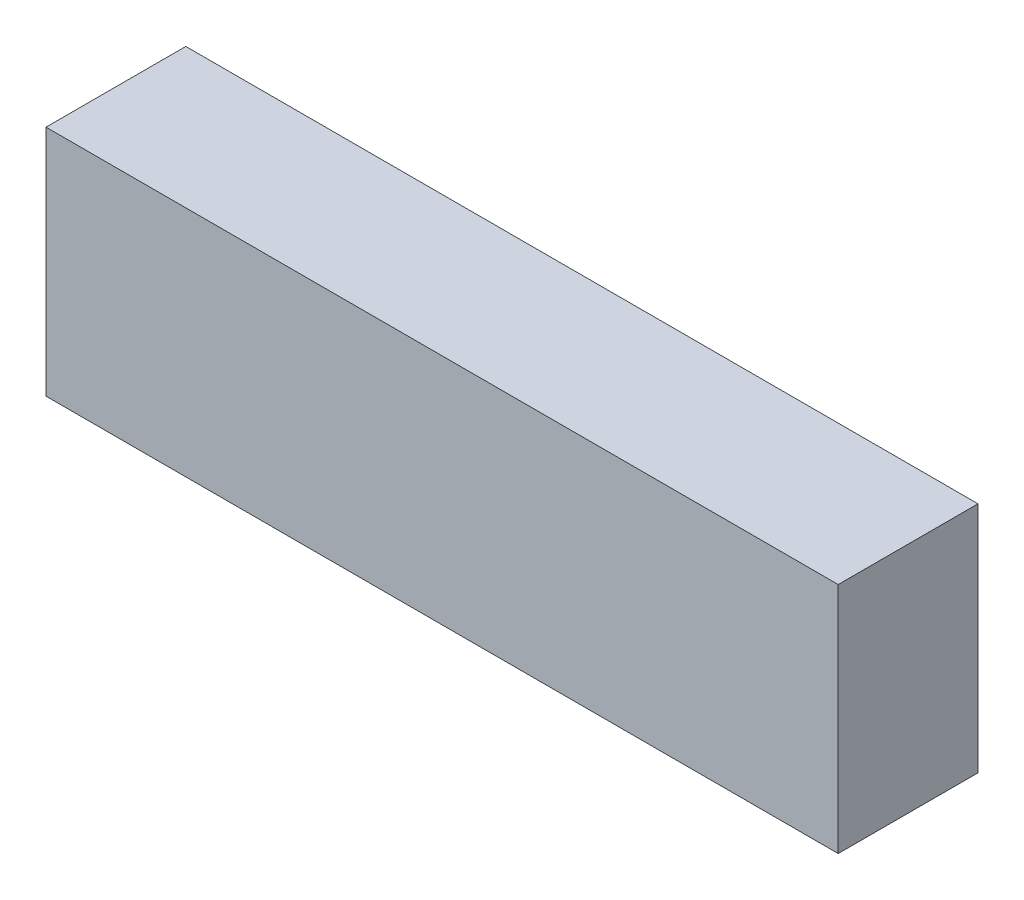
ISO-10303-21;
HEADER;
FILE_DESCRIPTION(('STEP AP214'),'2;1');
FILE_NAME('part.step','',(''),(''),'','','');
FILE_SCHEMA(('AUTOMOTIVE_DESIGN { 1 0 10303 214 1 1 1 1 }'));
ENDSEC;
DATA;
#1=APPLICATION_CONTEXT('core data for automotive mechanical design processes');
#2=APPLICATION_PROTOCOL_DEFINITION('international standard','automotive_design',2000,#1);
#3=PRODUCT_CONTEXT('',#1,'mechanical');
#4=PRODUCT('Part','Part','',(#3));
#5=PRODUCT_RELATED_PRODUCT_CATEGORY('part','',(#4));
#6=PRODUCT_DEFINITION_FORMATION('','',#4);
#7=PRODUCT_DEFINITION_CONTEXT('part definition',#1,'design');
#8=PRODUCT_DEFINITION('design','',#6,#7);
#9=PRODUCT_DEFINITION_SHAPE('','',#8);
#10=(LENGTH_UNIT() NAMED_UNIT(*) SI_UNIT(.MILLI.,.METRE.));
#11=(NAMED_UNIT(*) PLANE_ANGLE_UNIT() SI_UNIT($,.RADIAN.));
#12=(NAMED_UNIT(*) SI_UNIT($,.STERADIAN.) SOLID_ANGLE_UNIT());
#13=UNCERTAINTY_MEASURE_WITH_UNIT(LENGTH_MEASURE(1.E-05),#10,'distance_accuracy_value','');
#14=(GEOMETRIC_REPRESENTATION_CONTEXT(3) GLOBAL_UNCERTAINTY_ASSIGNED_CONTEXT((#13)) GLOBAL_UNIT_ASSIGNED_CONTEXT((#10,
#11,#12)) REPRESENTATION_CONTEXT('',''));
#15=CARTESIAN_POINT('',(0.,0.,0.));
#16=DIRECTION('',(0.,0.,1.));
#17=DIRECTION('',(1.,0.,0.));
#18=AXIS2_PLACEMENT_3D('',#15,#16,#17);
#19=CARTESIAN_POINT('',(491.834843653032,1149.02699768533,153.1716134156));
#20=DIRECTION('',(1.,0.,0.));
#21=DIRECTION('',(0.,0.,-1.));
#22=AXIS2_PLACEMENT_3D('',#19,#20,#21);
#23=PLANE('',#22);
#24=DIRECTION('',(0.,-1.,0.));
#25=VECTOR('',#24,1.);
#26=CARTESIAN_POINT('',(491.834843653032,1149.02699768533,3.17161341559968));
#27=LINE('',#26,#25);
#28=CARTESIAN_POINT('',(491.834843653032,1149.02699768533,3.17161341559968));
#29=VERTEX_POINT('',#28);
#30=CARTESIAN_POINT('',(491.834843653032,899.026997685325,3.17161341559968));
#31=VERTEX_POINT('',#30);
#32=EDGE_CURVE('E96',#29,#31,#27,.T.);
#33=ORIENTED_EDGE('',*,*,#32,.T.);
#34=DIRECTION('',(0.,0.,-1.));
#35=VECTOR('',#34,1.);
#36=CARTESIAN_POINT('',(491.834843653032,899.026997685325,153.1716134156));
#37=LINE('',#36,#35);
#38=CARTESIAN_POINT('',(491.834843653032,899.026997685325,153.1716134156));
#39=VERTEX_POINT('',#38);
#40=EDGE_CURVE('E11',#39,#31,#37,.T.);
#41=ORIENTED_EDGE('',*,*,#40,.F.);
#42=DIRECTION('',(0.,-1.,0.));
#43=VECTOR('',#42,1.);
#44=CARTESIAN_POINT('',(491.834843653032,1149.02699768533,153.1716134156));
#45=LINE('',#44,#43);
#46=CARTESIAN_POINT('',(491.834843653032,1149.02699768533,153.1716134156));
#47=VERTEX_POINT('',#46);
#48=EDGE_CURVE('E84',#47,#39,#45,.T.);
#49=ORIENTED_EDGE('',*,*,#48,.F.);
#50=DIRECTION('',(0.,0.,-1.));
#51=VECTOR('',#50,1.);
#52=CARTESIAN_POINT('',(491.834843653032,1149.02699768533,153.1716134156));
#53=LINE('',#52,#51);
#54=EDGE_CURVE('E92',#47,#29,#53,.T.);
#55=ORIENTED_EDGE('',*,*,#54,.T.);
#56=EDGE_LOOP('',(#33,#41,#49,#55));
#57=FACE_BOUND('',#56,.T.);
#58=ADVANCED_FACE('F33',(#57),#23,.F.);
#59=CARTESIAN_POINT('',(491.834843653032,899.026997685325,153.1716134156));
#60=DIRECTION('',(0.,1.,0.));
#61=DIRECTION('',(0.,0.,1.));
#62=AXIS2_PLACEMENT_3D('',#59,#60,#61);
#63=PLANE('',#62);
#64=DIRECTION('',(1.,0.,0.));
#65=VECTOR('',#64,1.);
#66=CARTESIAN_POINT('',(491.834843653032,899.026997685325,3.17161341559968));
#67=LINE('',#66,#65);
#68=CARTESIAN_POINT('',(1341.83484365303,899.026997685325,3.17161341559968));
#69=VERTEX_POINT('',#68);
#70=EDGE_CURVE('E88',#31,#69,#67,.T.);
#71=ORIENTED_EDGE('',*,*,#70,.T.);
#72=DIRECTION('',(0.,0.,-1.));
#73=VECTOR('',#72,1.);
#74=CARTESIAN_POINT('',(1341.83484365303,899.026997685325,153.1716134156));
#75=LINE('',#74,#73);
#76=CARTESIAN_POINT('',(1341.83484365303,899.026997685325,153.1716134156));
#77=VERTEX_POINT('',#76);
#78=EDGE_CURVE('E41',#77,#69,#75,.T.);
#79=ORIENTED_EDGE('',*,*,#78,.F.);
#80=DIRECTION('',(1.,0.,0.));
#81=VECTOR('',#80,1.);
#82=CARTESIAN_POINT('',(491.834843653032,899.026997685325,153.1716134156));
#83=LINE('',#82,#81);
#84=EDGE_CURVE('E79',#39,#77,#83,.T.);
#85=ORIENTED_EDGE('',*,*,#84,.F.);
#86=ORIENTED_EDGE('',*,*,#40,.T.);
#87=EDGE_LOOP('',(#71,#79,#85,#86));
#88=FACE_BOUND('',#87,.T.);
#89=ADVANCED_FACE('F87',(#88),#63,.F.);
#90=CARTESIAN_POINT('',(1341.83484365303,1149.02699768533,153.1716134156));
#91=DIRECTION('',(-1.,0.,0.));
#92=DIRECTION('',(0.,0.,1.));
#93=AXIS2_PLACEMENT_3D('',#90,#91,#92);
#94=PLANE('',#93);
#95=DIRECTION('',(0.,1.,0.));
#96=VECTOR('',#95,1.);
#97=CARTESIAN_POINT('',(1341.83484365303,1149.02699768533,3.17161341559968));
#98=LINE('',#97,#96);
#99=CARTESIAN_POINT('',(1341.83484365303,1149.02699768533,3.17161341559968));
#100=VERTEX_POINT('',#99);
#101=EDGE_CURVE('E66',#69,#100,#98,.T.);
#102=ORIENTED_EDGE('',*,*,#101,.T.);
#103=DIRECTION('',(0.,0.,-1.));
#104=VECTOR('',#103,1.);
#105=CARTESIAN_POINT('',(1341.83484365303,1149.02699768533,153.1716134156));
#106=LINE('',#105,#104);
#107=CARTESIAN_POINT('',(1341.83484365303,1149.02699768533,153.1716134156));
#108=VERTEX_POINT('',#107);
#109=EDGE_CURVE('E89',#108,#100,#106,.T.);
#110=ORIENTED_EDGE('',*,*,#109,.F.);
#111=DIRECTION('',(0.,1.,0.));
#112=VECTOR('',#111,1.);
#113=CARTESIAN_POINT('',(1341.83484365303,1149.02699768533,153.1716134156));
#114=LINE('',#113,#112);
#115=EDGE_CURVE('E82',#77,#108,#114,.T.);
#116=ORIENTED_EDGE('',*,*,#115,.F.);
#117=ORIENTED_EDGE('',*,*,#78,.T.);
#118=EDGE_LOOP('',(#102,#110,#116,#117));
#119=FACE_BOUND('',#118,.T.);
#120=ADVANCED_FACE('F90',(#119),#94,.F.);
#121=CARTESIAN_POINT('',(491.834843653032,1149.02699768533,153.1716134156));
#122=DIRECTION('',(0.,-1.,0.));
#123=DIRECTION('',(0.,0.,-1.));
#124=AXIS2_PLACEMENT_3D('',#121,#122,#123);
#125=PLANE('',#124);
#126=DIRECTION('',(-1.,0.,0.));
#127=VECTOR('',#126,1.);
#128=CARTESIAN_POINT('',(491.834843653032,1149.02699768533,3.17161341559968));
#129=LINE('',#128,#127);
#130=EDGE_CURVE('E72',#100,#29,#129,.T.);
#131=ORIENTED_EDGE('',*,*,#130,.T.);
#132=ORIENTED_EDGE('',*,*,#54,.F.);
#133=DIRECTION('',(-1.,0.,0.));
#134=VECTOR('',#133,1.);
#135=CARTESIAN_POINT('',(491.834843653032,1149.02699768533,153.1716134156));
#136=LINE('',#135,#134);
#137=EDGE_CURVE('E49',#108,#47,#136,.T.);
#138=ORIENTED_EDGE('',*,*,#137,.F.);
#139=ORIENTED_EDGE('',*,*,#109,.T.);
#140=EDGE_LOOP('',(#131,#132,#138,#139));
#141=FACE_BOUND('',#140,.T.);
#142=ADVANCED_FACE('F104',(#141),#125,.F.);
#143=CARTESIAN_POINT('',(0.,0.,153.1716134156));
#144=DIRECTION('',(0.,0.,1.));
#145=DIRECTION('',(1.,0.,0.));
#146=AXIS2_PLACEMENT_3D('',#143,#144,#145);
#147=PLANE('',#146);
#148=ORIENTED_EDGE('',*,*,#48,.T.);
#149=ORIENTED_EDGE('',*,*,#84,.T.);
#150=ORIENTED_EDGE('',*,*,#115,.T.);
#151=ORIENTED_EDGE('',*,*,#137,.T.);
#152=EDGE_LOOP('',(#148,#149,#150,#151));
#153=FACE_BOUND('',#152,.T.);
#154=ADVANCED_FACE('F80',(#153),#147,.T.);
#155=CARTESIAN_POINT('',(0.,0.,3.17161341559968));
#156=DIRECTION('',(0.,0.,1.));
#157=DIRECTION('',(1.,0.,0.));
#158=AXIS2_PLACEMENT_3D('',#155,#156,#157);
#159=PLANE('',#158);
#160=CARTESIAN_POINT('',(616.834843653032,1024.02699768533,3.17161341559968));
#161=DIRECTION('',(0.,0.,-1.));
#162=DIRECTION('',(-1.,0.,0.));
#163=AXIS2_PLACEMENT_3D('',#160,#161,#162);
#164=CIRCLE('',#163,75.);
#165=CARTESIAN_POINT('',(541.834843653032,1024.02699768533,3.17161341559968));
#166=VERTEX_POINT('',#165);
#167=EDGE_CURVE('E110',#166,#166,#164,.T.);
#168=ORIENTED_EDGE('',*,*,#167,.F.);
#169=EDGE_LOOP('',(#168));
#170=FACE_BOUND('',#169,.T.);
#171=ORIENTED_EDGE('',*,*,#32,.F.);
#172=ORIENTED_EDGE('',*,*,#130,.F.);
#173=ORIENTED_EDGE('',*,*,#101,.F.);
#174=ORIENTED_EDGE('',*,*,#70,.F.);
#175=EDGE_LOOP('',(#171,#172,#173,#174));
#176=FACE_BOUND('',#175,.T.);
#177=ADVANCED_FACE('F107',(#170,#176),#159,.F.);
#178=CARTESIAN_POINT('',(616.834843653032,1024.02699768533,53.1716134155997));
#179=DIRECTION('',(0.,0.,-1.));
#180=DIRECTION('',(-1.,0.,0.));
#181=AXIS2_PLACEMENT_3D('',#178,#179,#180);
#182=CYLINDRICAL_SURFACE('',#181,75.);
#183=CARTESIAN_POINT('',(616.834843653032,1024.02699768533,53.1716134155997));
#184=DIRECTION('',(0.,0.,-1.));
#185=DIRECTION('',(-1.,0.,0.));
#186=AXIS2_PLACEMENT_3D('',#183,#184,#185);
#187=CIRCLE('',#186,75.);
#188=CARTESIAN_POINT('',(541.834843653032,1024.02699768533,53.1716134155997));
#189=VERTEX_POINT('',#188);
#190=EDGE_CURVE('E99',#189,#189,#187,.T.);
#191=ORIENTED_EDGE('',*,*,#190,.F.);
#192=EDGE_LOOP('',(#191));
#193=FACE_BOUND('',#192,.T.);
#194=ORIENTED_EDGE('',*,*,#167,.T.);
#195=EDGE_LOOP('',(#194));
#196=FACE_BOUND('',#195,.T.);
#197=ADVANCED_FACE('F118',(#193,#196),#182,.F.);
#198=CARTESIAN_POINT('',(616.834843653032,1024.02699768533,53.1716134155997));
#199=DIRECTION('',(0.,0.,-1.));
#200=DIRECTION('',(-1.,0.,0.));
#201=AXIS2_PLACEMENT_3D('',#198,#199,#200);
#202=PLANE('',#201);
#203=ORIENTED_EDGE('',*,*,#190,.T.);
#204=EDGE_LOOP('',(#203));
#205=FACE_BOUND('',#204,.T.);
#206=ADVANCED_FACE('F116',(#205),#202,.T.);
#207=CLOSED_SHELL('',(#58,#89,#120,#142,#154,#177,#197,#206));
#208=MANIFOLD_SOLID_BREP('B2',#207);
#209=ADVANCED_BREP_SHAPE_REPRESENTATION('',(#18,#208),#14);
#210=SHAPE_DEFINITION_REPRESENTATION(#9,#209);
ENDSEC;
END-ISO-10303-21;
